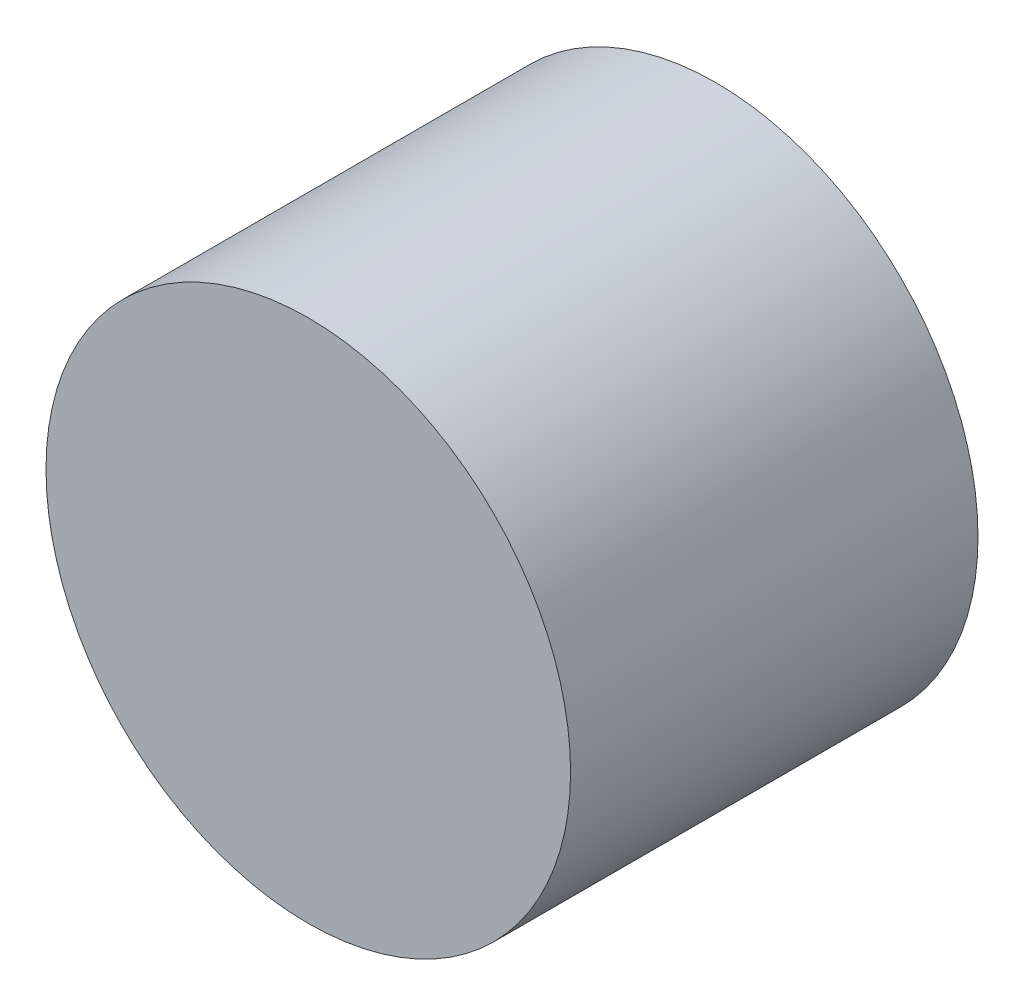
ISO-10303-21;
HEADER;
FILE_DESCRIPTION(('STEP AP214'),'2;1');
FILE_NAME('part.step','',(''),(''),'','','');
FILE_SCHEMA(('AUTOMOTIVE_DESIGN { 1 0 10303 214 1 1 1 1 }'));
ENDSEC;
DATA;
#1=APPLICATION_CONTEXT('core data for automotive mechanical design processes');
#2=APPLICATION_PROTOCOL_DEFINITION('international standard','automotive_design',2000,#1);
#3=PRODUCT_CONTEXT('',#1,'mechanical');
#4=PRODUCT('Part','Part','',(#3));
#5=PRODUCT_RELATED_PRODUCT_CATEGORY('part','',(#4));
#6=PRODUCT_DEFINITION_FORMATION('','',#4);
#7=PRODUCT_DEFINITION_CONTEXT('part definition',#1,'design');
#8=PRODUCT_DEFINITION('design','',#6,#7);
#9=PRODUCT_DEFINITION_SHAPE('','',#8);
#10=(LENGTH_UNIT() NAMED_UNIT(*) SI_UNIT(.MILLI.,.METRE.));
#11=(NAMED_UNIT(*) PLANE_ANGLE_UNIT() SI_UNIT($,.RADIAN.));
#12=(NAMED_UNIT(*) SI_UNIT($,.STERADIAN.) SOLID_ANGLE_UNIT());
#13=UNCERTAINTY_MEASURE_WITH_UNIT(LENGTH_MEASURE(1.E-05),#10,'distance_accuracy_value','');
#14=(GEOMETRIC_REPRESENTATION_CONTEXT(3) GLOBAL_UNCERTAINTY_ASSIGNED_CONTEXT((#13)) GLOBAL_UNIT_ASSIGNED_CONTEXT((#10,
#11,#12)) REPRESENTATION_CONTEXT('',''));
#15=CARTESIAN_POINT('',(0.,0.,0.));
#16=DIRECTION('',(0.,0.,1.));
#17=DIRECTION('',(1.,0.,0.));
#18=AXIS2_PLACEMENT_3D('',#15,#16,#17);
#19=CARTESIAN_POINT('',(7.125,-5.675,17.825));
#20=DIRECTION('',(0.,0.,-1.));
#21=DIRECTION('',(-1.,0.,0.));
#22=AXIS2_PLACEMENT_3D('',#19,#20,#21);
#23=CYLINDRICAL_SURFACE('',#22,11.475);
#24=CARTESIAN_POINT('',(7.125,-5.675,17.825));
#25=DIRECTION('',(0.,0.,1.));
#26=DIRECTION('',(1.,0.,0.));
#27=AXIS2_PLACEMENT_3D('',#24,#25,#26);
#28=CIRCLE('',#27,11.475);
#29=CARTESIAN_POINT('',(18.6,-5.675,17.825));
#30=VERTEX_POINT('',#29);
#31=EDGE_CURVE('E10',#30,#30,#28,.T.);
#32=ORIENTED_EDGE('',*,*,#31,.F.);
#33=EDGE_LOOP('',(#32));
#34=FACE_BOUND('',#33,.T.);
#35=CARTESIAN_POINT('',(7.125,-5.675,0.));
#36=DIRECTION('',(0.,0.,1.));
#37=DIRECTION('',(1.,0.,0.));
#38=AXIS2_PLACEMENT_3D('',#35,#36,#37);
#39=CIRCLE('',#38,11.475);
#40=CARTESIAN_POINT('',(18.6,-5.675,0.));
#41=VERTEX_POINT('',#40);
#42=EDGE_CURVE('E45',#41,#41,#39,.T.);
#43=ORIENTED_EDGE('',*,*,#42,.T.);
#44=EDGE_LOOP('',(#43));
#45=FACE_BOUND('',#44,.T.);
#46=ADVANCED_FACE('F39',(#34,#45),#23,.T.);
#47=CARTESIAN_POINT('',(7.125,-5.675,17.825));
#48=DIRECTION('',(0.,0.,1.));
#49=DIRECTION('',(1.,0.,0.));
#50=AXIS2_PLACEMENT_3D('',#47,#48,#49);
#51=PLANE('',#50);
#52=ORIENTED_EDGE('',*,*,#31,.T.);
#53=EDGE_LOOP('',(#52));
#54=FACE_BOUND('',#53,.T.);
#55=ADVANCED_FACE('F53',(#54),#51,.T.);
#56=CARTESIAN_POINT('',(7.125,-5.675,0.));
#57=DIRECTION('',(0.,0.,1.));
#58=DIRECTION('',(1.,0.,0.));
#59=AXIS2_PLACEMENT_3D('',#56,#57,#58);
#60=PLANE('',#59);
#61=ORIENTED_EDGE('',*,*,#42,.F.);
#62=EDGE_LOOP('',(#61));
#63=FACE_BOUND('',#62,.T.);
#64=ADVANCED_FACE('F55',(#63),#60,.F.);
#65=CLOSED_SHELL('',(#46,#55,#64));
#66=MANIFOLD_SOLID_BREP('B2',#65);
#67=ADVANCED_BREP_SHAPE_REPRESENTATION('',(#18,#66),#14);
#68=SHAPE_DEFINITION_REPRESENTATION(#9,#67);
ENDSEC;
END-ISO-10303-21;
